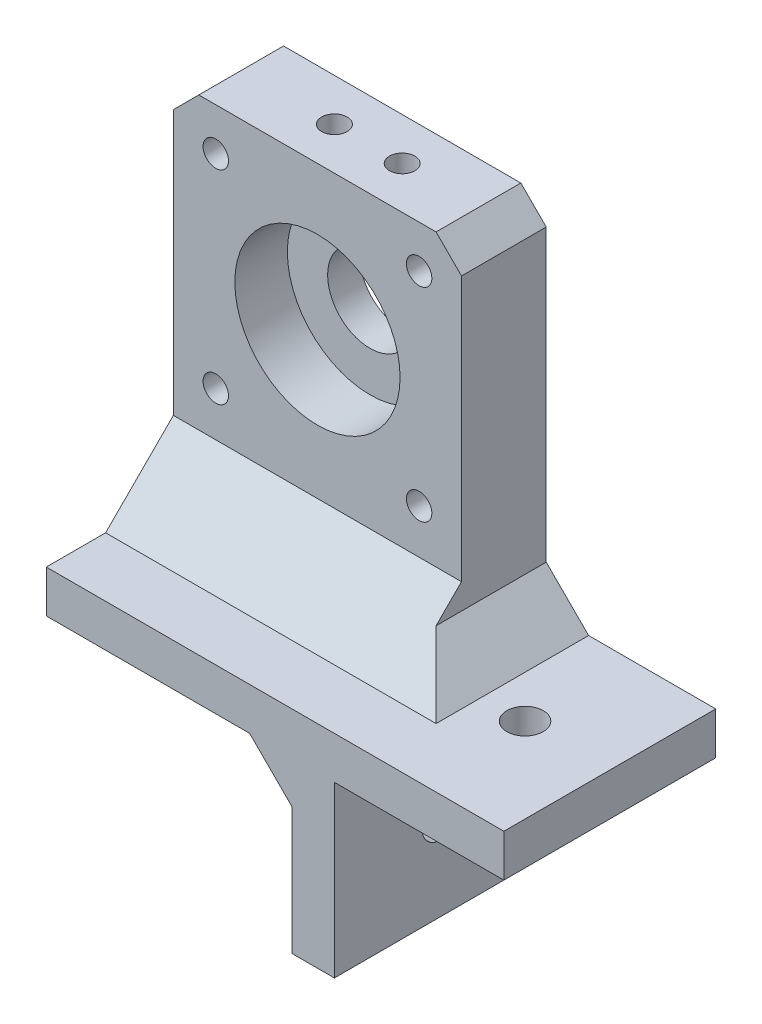
ISO-10303-21;
HEADER;
FILE_DESCRIPTION(('STEP AP214'),'2;1');
FILE_NAME('part.step','',(''),(''),'','','');
FILE_SCHEMA(('AUTOMOTIVE_DESIGN { 1 0 10303 214 1 1 1 1 }'));
ENDSEC;
DATA;
#1=APPLICATION_CONTEXT('core data for automotive mechanical design processes');
#2=APPLICATION_PROTOCOL_DEFINITION('international standard','automotive_design',2000,#1);
#3=PRODUCT_CONTEXT('',#1,'mechanical');
#4=PRODUCT('Part','Part','',(#3));
#5=PRODUCT_RELATED_PRODUCT_CATEGORY('part','',(#4));
#6=PRODUCT_DEFINITION_FORMATION('','',#4);
#7=PRODUCT_DEFINITION_CONTEXT('part definition',#1,'design');
#8=PRODUCT_DEFINITION('design','',#6,#7);
#9=PRODUCT_DEFINITION_SHAPE('','',#8);
#10=(LENGTH_UNIT() NAMED_UNIT(*) SI_UNIT(.MILLI.,.METRE.));
#11=(NAMED_UNIT(*) PLANE_ANGLE_UNIT() SI_UNIT($,.RADIAN.));
#12=(NAMED_UNIT(*) SI_UNIT($,.STERADIAN.) SOLID_ANGLE_UNIT());
#13=UNCERTAINTY_MEASURE_WITH_UNIT(LENGTH_MEASURE(1.E-05),#10,'distance_accuracy_value','');
#14=(GEOMETRIC_REPRESENTATION_CONTEXT(3) GLOBAL_UNCERTAINTY_ASSIGNED_CONTEXT((#13)) GLOBAL_UNIT_ASSIGNED_CONTEXT((#10,
#11,#12)) REPRESENTATION_CONTEXT('',''));
#15=CARTESIAN_POINT('',(0.,0.,0.));
#16=DIRECTION('',(0.,0.,1.));
#17=DIRECTION('',(1.,0.,0.));
#18=AXIS2_PLACEMENT_3D('',#15,#16,#17);
#19=CARTESIAN_POINT('',(-34.0000000000053,20.,25.));
#20=DIRECTION('',(0.,1.,0.));
#21=DIRECTION('',(-1.,0.,0.));
#22=AXIS2_PLACEMENT_3D('',#19,#20,#21);
#23=PLANE('',#22);
#24=DIRECTION('',(-1.,0.,0.));
#25=VECTOR('',#24,1.);
#26=CARTESIAN_POINT('',(-34.0000000000053,20.,30.));
#27=LINE('',#26,#25);
#28=CARTESIAN_POINT('',(-9.99999999999999,20.,30.));
#29=VERTEX_POINT('',#28);
#30=CARTESIAN_POINT('',(-34.0000000000053,20.,30.));
#31=VERTEX_POINT('',#30);
#32=EDGE_CURVE('E169',#29,#31,#27,.T.);
#33=ORIENTED_EDGE('',*,*,#32,.F.);
#34=DIRECTION('',(0.,0.,-1.));
#35=VECTOR('',#34,1.);
#36=CARTESIAN_POINT('',(-9.99999999999998,20.,25.));
#37=LINE('',#36,#35);
#38=CARTESIAN_POINT('',(-9.99999999999999,20.,50.));
#39=VERTEX_POINT('',#38);
#40=EDGE_CURVE('E361',#39,#29,#37,.T.);
#41=ORIENTED_EDGE('',*,*,#40,.F.);
#42=DIRECTION('',(1.,0.,0.));
#43=VECTOR('',#42,1.);
#44=CARTESIAN_POINT('',(-34.0000000000053,20.,50.));
#45=LINE('',#44,#43);
#46=CARTESIAN_POINT('',(-34.0000000000053,20.,50.));
#47=VERTEX_POINT('',#46);
#48=EDGE_CURVE('E329',#47,#39,#45,.T.);
#49=ORIENTED_EDGE('',*,*,#48,.F.);
#50=DIRECTION('',(0.,0.,1.));
#51=VECTOR('',#50,1.);
#52=CARTESIAN_POINT('',(-34.0000000000053,20.,25.));
#53=LINE('',#52,#51);
#54=EDGE_CURVE('E184',#31,#47,#53,.T.);
#55=ORIENTED_EDGE('',*,*,#54,.F.);
#56=EDGE_LOOP('',(#33,#41,#49,#55));
#57=FACE_BOUND('',#56,.T.);
#58=ADVANCED_FACE('F40',(#57),#23,.F.);
#59=CARTESIAN_POINT('',(-5.,20.,25.));
#60=DIRECTION('',(1.,0.,0.));
#61=DIRECTION('',(0.,1.,0.));
#62=AXIS2_PLACEMENT_3D('',#59,#60,#61);
#63=PLANE('',#62);
#64=CARTESIAN_POINT('',(-5.,10.,37.5));
#65=DIRECTION('',(-1.,0.,0.));
#66=DIRECTION('',(0.,1.,0.));
#67=AXIS2_PLACEMENT_3D('',#64,#65,#66);
#68=CIRCLE('',#67,2.15);
#69=CARTESIAN_POINT('',(-5.,12.15,37.5));
#70=VERTEX_POINT('',#69);
#71=EDGE_CURVE('E256',#70,#70,#68,.T.);
#72=ORIENTED_EDGE('',*,*,#71,.F.);
#73=EDGE_LOOP('',(#72));
#74=FACE_BOUND('',#73,.T.);
#75=DIRECTION('',(0.,1.,0.));
#76=VECTOR('',#75,1.);
#77=CARTESIAN_POINT('',(-5.,15.,30.));
#78=LINE('',#77,#76);
#79=CARTESIAN_POINT('',(-5.,0.,30.));
#80=VERTEX_POINT('',#79);
#81=CARTESIAN_POINT('',(-5.,15.,30.));
#82=VERTEX_POINT('',#81);
#83=EDGE_CURVE('E167',#80,#82,#78,.T.);
#84=ORIENTED_EDGE('',*,*,#83,.F.);
#85=DIRECTION('',(0.,0.,1.));
#86=VECTOR('',#85,1.);
#87=CARTESIAN_POINT('',(-5.,0.,25.));
#88=LINE('',#87,#86);
#89=CARTESIAN_POINT('',(-5.,0.,50.));
#90=VERTEX_POINT('',#89);
#91=EDGE_CURVE('E185',#80,#90,#88,.T.);
#92=ORIENTED_EDGE('',*,*,#91,.T.);
#93=DIRECTION('',(0.,-1.,0.));
#94=VECTOR('',#93,1.);
#95=CARTESIAN_POINT('',(-5.,20.,50.));
#96=LINE('',#95,#94);
#97=CARTESIAN_POINT('',(-5.,15.,50.));
#98=VERTEX_POINT('',#97);
#99=EDGE_CURVE('E281',#98,#90,#96,.T.);
#100=ORIENTED_EDGE('',*,*,#99,.F.);
#101=DIRECTION('',(0.,0.,1.));
#102=VECTOR('',#101,1.);
#103=CARTESIAN_POINT('',(-5.,15.,50.));
#104=LINE('',#103,#102);
#105=EDGE_CURVE('E199',#82,#98,#104,.T.);
#106=ORIENTED_EDGE('',*,*,#105,.F.);
#107=EDGE_LOOP('',(#84,#92,#100,#106));
#108=FACE_BOUND('',#107,.T.);
#109=ADVANCED_FACE('F197',(#74,#108),#63,.F.);
#110=CARTESIAN_POINT('',(-5.,15.,25.));
#111=DIRECTION('',(-0.707106781186551,-0.707106781186544,0.));
#112=DIRECTION('',(0.,0.,-1.));
#113=AXIS2_PLACEMENT_3D('',#110,#111,#112);
#114=PLANE('',#113);
#115=DIRECTION('',(-0.707106781186545,0.70710678118655,0.));
#116=VECTOR('',#115,1.);
#117=CARTESIAN_POINT('',(-9.99999999999999,20.,30.));
#118=LINE('',#117,#116);
#119=EDGE_CURVE('E201',#82,#29,#118,.T.);
#120=ORIENTED_EDGE('',*,*,#119,.F.);
#121=ORIENTED_EDGE('',*,*,#105,.T.);
#122=DIRECTION('',(0.707106781186544,-0.707106781186551,0.));
#123=VECTOR('',#122,1.);
#124=CARTESIAN_POINT('',(4.99999999999996,4.99999999999991,50.));
#125=LINE('',#124,#123);
#126=EDGE_CURVE('E370',#98,#39,#125,.F.);
#127=ORIENTED_EDGE('',*,*,#126,.T.);
#128=ORIENTED_EDGE('',*,*,#40,.T.);
#129=EDGE_LOOP('',(#120,#121,#127,#128));
#130=FACE_BOUND('',#129,.T.);
#131=ADVANCED_FACE('F472',(#130),#114,.T.);
#132=CARTESIAN_POINT('',(-17.0000000000053,50.25,25.));
#133=DIRECTION('',(0.,0.,1.));
#134=DIRECTION('',(-1.,0.,0.));
#135=AXIS2_PLACEMENT_3D('',#132,#133,#134);
#136=CYLINDRICAL_SURFACE('',#135,5.);
#137=CARTESIAN_POINT('',(-17.0000000000053,50.25,25.));
#138=DIRECTION('',(0.,0.,1.));
#139=DIRECTION('',(1.,0.,0.));
#140=AXIS2_PLACEMENT_3D('',#137,#138,#139);
#141=CIRCLE('',#140,5.);
#142=CARTESIAN_POINT('',(-12.0000000000053,50.25,25.));
#143=VERTEX_POINT('',#142);
#144=EDGE_CURVE('E273',#143,#143,#141,.T.);
#145=ORIENTED_EDGE('',*,*,#144,.F.);
#146=EDGE_LOOP('',(#145));
#147=FACE_BOUND('',#146,.T.);
#148=CARTESIAN_POINT('',(-17.0000000000053,50.25,28.8));
#149=DIRECTION('',(0.,0.,-1.));
#150=DIRECTION('',(-1.,0.,0.));
#151=AXIS2_PLACEMENT_3D('',#148,#149,#150);
#152=CIRCLE('',#151,5.);
#153=CARTESIAN_POINT('',(-22.0000000000053,50.25,28.8));
#154=VERTEX_POINT('',#153);
#155=EDGE_CURVE('E217',#154,#154,#152,.T.);
#156=ORIENTED_EDGE('',*,*,#155,.F.);
#157=EDGE_LOOP('',(#156));
#158=FACE_BOUND('',#157,.T.);
#159=ADVANCED_FACE('F474',(#147,#158),#136,.F.);
#160=CARTESIAN_POINT('',(-5.27702881392145E-12,25.,25.));
#161=DIRECTION('',(-1.,0.,0.));
#162=DIRECTION('',(0.,-1.,0.));
#163=AXIS2_PLACEMENT_3D('',#160,#161,#162);
#164=PLANE('',#163);
#165=DIRECTION('',(0.,-1.,0.));
#166=VECTOR('',#165,1.);
#167=CARTESIAN_POINT('',(-5.27588648512213E-12,67.25,35.));
#168=LINE('',#167,#166);
#169=CARTESIAN_POINT('',(-5.27626343105073E-12,64.25,35.));
#170=VERTEX_POINT('',#169);
#171=CARTESIAN_POINT('',(-5.2801899511403E-12,33.,35.));
#172=VERTEX_POINT('',#171);
#173=EDGE_CURVE('E221',#170,#172,#168,.T.);
#174=ORIENTED_EDGE('',*,*,#173,.T.);
#175=DIRECTION('',(0.,-0.707106781186544,0.707106781186551));
#176=VECTOR('',#175,1.);
#177=CARTESIAN_POINT('',(-5.27678547760917E-12,34.,34.));
#178=LINE('',#177,#176);
#179=CARTESIAN_POINT('',(-5.27689362708129E-12,30.,38.));
#180=VERTEX_POINT('',#179);
#181=EDGE_CURVE('E50',#172,#180,#178,.T.);
#182=ORIENTED_EDGE('',*,*,#181,.T.);
#183=DIRECTION('',(0.,0.,1.));
#184=VECTOR('',#183,1.);
#185=CARTESIAN_POINT('',(-5.27689362708129E-12,30.,35.));
#186=LINE('',#185,#184);
#187=CARTESIAN_POINT('',(-5.27689362708129E-12,30.,25.));
#188=VERTEX_POINT('',#187);
#189=EDGE_CURVE('E56',#188,#180,#186,.T.);
#190=ORIENTED_EDGE('',*,*,#189,.F.);
#191=DIRECTION('',(0.,1.,0.));
#192=VECTOR('',#191,1.);
#193=CARTESIAN_POINT('',(-5.27702881392145E-12,25.,25.));
#194=LINE('',#193,#192);
#195=CARTESIAN_POINT('',(-5.27596759722623E-12,64.25,25.));
#196=VERTEX_POINT('',#195);
#197=EDGE_CURVE('E297',#188,#196,#194,.T.);
#198=ORIENTED_EDGE('',*,*,#197,.T.);
#199=DIRECTION('',(0.,0.,-1.));
#200=VECTOR('',#199,1.);
#201=CARTESIAN_POINT('',(-5.27596759722623E-12,64.25,25.));
#202=LINE('',#201,#200);
#203=EDGE_CURVE('E401',#170,#196,#202,.T.);
#204=ORIENTED_EDGE('',*,*,#203,.F.);
#205=EDGE_LOOP('',(#174,#182,#190,#198,#204));
#206=FACE_BOUND('',#205,.T.);
#207=ADVANCED_FACE('F420',(#206),#164,.F.);
#208=CARTESIAN_POINT('',(-5.27588648512213E-12,67.25,25.));
#209=DIRECTION('',(0.,-1.,0.));
#210=DIRECTION('',(0.,0.,1.));
#211=AXIS2_PLACEMENT_3D('',#208,#209,#210);
#212=PLANE('',#211);
#213=CARTESIAN_POINT('',(-12.0000000000053,67.25,30.));
#214=DIRECTION('',(0.,1.,0.));
#215=DIRECTION('',(0.,0.,1.));
#216=AXIS2_PLACEMENT_3D('',#213,#214,#215);
#217=CIRCLE('',#216,1.5);
#218=CARTESIAN_POINT('',(-12.0000000000053,67.25,31.5));
#219=VERTEX_POINT('',#218);
#220=EDGE_CURVE('E596',#219,#219,#217,.T.);
#221=ORIENTED_EDGE('',*,*,#220,.F.);
#222=EDGE_LOOP('',(#221));
#223=FACE_BOUND('',#222,.T.);
#224=CARTESIAN_POINT('',(-20.0000000000053,67.25,30.));
#225=DIRECTION('',(0.,1.,0.));
#226=DIRECTION('',(0.,0.,1.));
#227=AXIS2_PLACEMENT_3D('',#224,#225,#226);
#228=CIRCLE('',#227,1.5);
#229=CARTESIAN_POINT('',(-20.0000000000053,67.25,31.5));
#230=VERTEX_POINT('',#229);
#231=EDGE_CURVE('E609',#230,#230,#228,.T.);
#232=ORIENTED_EDGE('',*,*,#231,.F.);
#233=EDGE_LOOP('',(#232));
#234=FACE_BOUND('',#233,.T.);
#235=DIRECTION('',(1.,0.,0.));
#236=VECTOR('',#235,1.);
#237=CARTESIAN_POINT('',(-5.27588648512213E-12,67.25,35.));
#238=LINE('',#237,#236);
#239=CARTESIAN_POINT('',(-31.0000000000053,67.25,35.));
#240=VERTEX_POINT('',#239);
#241=CARTESIAN_POINT('',(-3.00000000000528,67.25,35.));
#242=VERTEX_POINT('',#241);
#243=EDGE_CURVE('E227',#240,#242,#238,.T.);
#244=ORIENTED_EDGE('',*,*,#243,.T.);
#245=DIRECTION('',(0.,0.,1.));
#246=VECTOR('',#245,1.);
#247=CARTESIAN_POINT('',(-3.00000000000528,67.25,25.));
#248=LINE('',#247,#246);
#249=CARTESIAN_POINT('',(-3.00000000000528,67.25,25.));
#250=VERTEX_POINT('',#249);
#251=EDGE_CURVE('E386',#250,#242,#248,.T.);
#252=ORIENTED_EDGE('',*,*,#251,.F.);
#253=DIRECTION('',(-1.,0.,0.));
#254=VECTOR('',#253,1.);
#255=CARTESIAN_POINT('',(-5.27588648512213E-12,67.25,25.));
#256=LINE('',#255,#254);
#257=CARTESIAN_POINT('',(-31.0000000000053,67.25,25.));
#258=VERTEX_POINT('',#257);
#259=EDGE_CURVE('E301',#250,#258,#256,.T.);
#260=ORIENTED_EDGE('',*,*,#259,.T.);
#261=DIRECTION('',(0.,0.,-1.));
#262=VECTOR('',#261,1.);
#263=CARTESIAN_POINT('',(-31.0000000000053,67.25,25.));
#264=LINE('',#263,#262);
#265=EDGE_CURVE('E390',#240,#258,#264,.T.);
#266=ORIENTED_EDGE('',*,*,#265,.F.);
#267=EDGE_LOOP('',(#244,#252,#260,#266));
#268=FACE_BOUND('',#267,.T.);
#269=ADVANCED_FACE('F444',(#223,#234,#268),#212,.F.);
#270=CARTESIAN_POINT('',(-29.0000000000053,62.25,25.));
#271=DIRECTION('',(0.,0.,1.));
#272=DIRECTION('',(-1.,0.,0.));
#273=AXIS2_PLACEMENT_3D('',#270,#271,#272);
#274=CYLINDRICAL_SURFACE('',#273,1.5);
#275=CARTESIAN_POINT('',(-29.0000000000053,62.25,25.));
#276=DIRECTION('',(0.,0.,1.));
#277=DIRECTION('',(1.,0.,0.));
#278=AXIS2_PLACEMENT_3D('',#275,#276,#277);
#279=CIRCLE('',#278,1.5);
#280=CARTESIAN_POINT('',(-27.5000000000053,62.25,25.));
#281=VERTEX_POINT('',#280);
#282=EDGE_CURVE('E269',#281,#281,#279,.T.);
#283=ORIENTED_EDGE('',*,*,#282,.F.);
#284=EDGE_LOOP('',(#283));
#285=FACE_BOUND('',#284,.T.);
#286=CARTESIAN_POINT('',(-29.0000000000053,62.25,35.));
#287=DIRECTION('',(0.,0.,-1.));
#288=DIRECTION('',(-1.,0.,0.));
#289=AXIS2_PLACEMENT_3D('',#286,#287,#288);
#290=CIRCLE('',#289,1.5);
#291=CARTESIAN_POINT('',(-30.5000000000053,62.25,35.));
#292=VERTEX_POINT('',#291);
#293=EDGE_CURVE('E243',#292,#292,#290,.T.);
#294=ORIENTED_EDGE('',*,*,#293,.F.);
#295=EDGE_LOOP('',(#294));
#296=FACE_BOUND('',#295,.T.);
#297=ADVANCED_FACE('F498',(#285,#296),#274,.F.);
#298=CARTESIAN_POINT('',(-5.00000000000528,62.25,25.));
#299=DIRECTION('',(0.,0.,1.));
#300=DIRECTION('',(-1.,0.,0.));
#301=AXIS2_PLACEMENT_3D('',#298,#299,#300);
#302=CYLINDRICAL_SURFACE('',#301,1.5);
#303=CARTESIAN_POINT('',(-5.00000000000528,62.25,25.));
#304=DIRECTION('',(0.,0.,1.));
#305=DIRECTION('',(1.,0.,0.));
#306=AXIS2_PLACEMENT_3D('',#303,#304,#305);
#307=CIRCLE('',#306,1.5);
#308=CARTESIAN_POINT('',(-3.50000000000528,62.25,25.));
#309=VERTEX_POINT('',#308);
#310=EDGE_CURVE('E265',#309,#309,#307,.T.);
#311=ORIENTED_EDGE('',*,*,#310,.F.);
#312=EDGE_LOOP('',(#311));
#313=FACE_BOUND('',#312,.T.);
#314=CARTESIAN_POINT('',(-5.00000000000528,62.25,35.));
#315=DIRECTION('',(0.,0.,-1.));
#316=DIRECTION('',(-1.,0.,0.));
#317=AXIS2_PLACEMENT_3D('',#314,#315,#316);
#318=CIRCLE('',#317,1.5);
#319=CARTESIAN_POINT('',(-6.50000000000528,62.25,35.));
#320=VERTEX_POINT('',#319);
#321=EDGE_CURVE('E239',#320,#320,#318,.T.);
#322=ORIENTED_EDGE('',*,*,#321,.F.);
#323=EDGE_LOOP('',(#322));
#324=FACE_BOUND('',#323,.T.);
#325=ADVANCED_FACE('F524',(#313,#324),#302,.F.);
#326=CARTESIAN_POINT('',(-29.0000000000053,38.25,25.));
#327=DIRECTION('',(0.,0.,1.));
#328=DIRECTION('',(-1.,0.,0.));
#329=AXIS2_PLACEMENT_3D('',#326,#327,#328);
#330=CYLINDRICAL_SURFACE('',#329,1.5);
#331=CARTESIAN_POINT('',(-29.0000000000053,38.25,25.));
#332=DIRECTION('',(0.,0.,1.));
#333=DIRECTION('',(1.,0.,0.));
#334=AXIS2_PLACEMENT_3D('',#331,#332,#333);
#335=CIRCLE('',#334,1.5);
#336=CARTESIAN_POINT('',(-27.5000000000053,38.25,25.));
#337=VERTEX_POINT('',#336);
#338=EDGE_CURVE('E261',#337,#337,#335,.T.);
#339=ORIENTED_EDGE('',*,*,#338,.F.);
#340=EDGE_LOOP('',(#339));
#341=FACE_BOUND('',#340,.T.);
#342=CARTESIAN_POINT('',(-29.0000000000053,38.25,35.));
#343=DIRECTION('',(0.,0.,-1.));
#344=DIRECTION('',(-1.,0.,0.));
#345=AXIS2_PLACEMENT_3D('',#342,#343,#344);
#346=CIRCLE('',#345,1.5);
#347=CARTESIAN_POINT('',(-30.5000000000053,38.25,35.));
#348=VERTEX_POINT('',#347);
#349=EDGE_CURVE('E235',#348,#348,#346,.T.);
#350=ORIENTED_EDGE('',*,*,#349,.F.);
#351=EDGE_LOOP('',(#350));
#352=FACE_BOUND('',#351,.T.);
#353=ADVANCED_FACE('F528',(#341,#352),#330,.F.);
#354=CARTESIAN_POINT('',(-5.00000000000528,38.25,25.));
#355=DIRECTION('',(0.,0.,1.));
#356=DIRECTION('',(-1.,0.,0.));
#357=AXIS2_PLACEMENT_3D('',#354,#355,#356);
#358=CYLINDRICAL_SURFACE('',#357,1.5);
#359=CARTESIAN_POINT('',(-5.00000000000528,38.25,25.));
#360=DIRECTION('',(0.,0.,1.));
#361=DIRECTION('',(1.,0.,0.));
#362=AXIS2_PLACEMENT_3D('',#359,#360,#361);
#363=CIRCLE('',#362,1.5);
#364=CARTESIAN_POINT('',(-3.50000000000528,38.25,25.));
#365=VERTEX_POINT('',#364);
#366=EDGE_CURVE('E257',#365,#365,#363,.T.);
#367=ORIENTED_EDGE('',*,*,#366,.F.);
#368=EDGE_LOOP('',(#367));
#369=FACE_BOUND('',#368,.T.);
#370=CARTESIAN_POINT('',(-5.00000000000528,38.25,35.));
#371=DIRECTION('',(0.,0.,-1.));
#372=DIRECTION('',(-1.,0.,0.));
#373=AXIS2_PLACEMENT_3D('',#370,#371,#372);
#374=CIRCLE('',#373,1.5);
#375=CARTESIAN_POINT('',(-6.50000000000528,38.25,35.));
#376=VERTEX_POINT('',#375);
#377=EDGE_CURVE('E234',#376,#376,#374,.T.);
#378=ORIENTED_EDGE('',*,*,#377,.F.);
#379=EDGE_LOOP('',(#378));
#380=FACE_BOUND('',#379,.T.);
#381=ADVANCED_FACE('F519',(#369,#380),#358,.F.);
#382=CARTESIAN_POINT('',(0.,0.,25.));
#383=DIRECTION('',(0.,0.,-1.));
#384=DIRECTION('',(1.,0.,0.));
#385=AXIS2_PLACEMENT_3D('',#382,#383,#384);
#386=PLANE('',#385);
#387=DIRECTION('',(0.823212785915355,-0.56773295580359,0.));
#388=VECTOR('',#387,1.);
#389=CARTESIAN_POINT('',(-5.,0.,25.));
#390=LINE('',#389,#388);
#391=CARTESIAN_POINT('',(-34.0000000000053,20.,25.));
#392=VERTEX_POINT('',#391);
#393=CARTESIAN_POINT('',(-5.,0.,25.));
#394=VERTEX_POINT('',#393);
#395=EDGE_CURVE('E173',#392,#394,#390,.T.);
#396=ORIENTED_EDGE('',*,*,#395,.F.);
#397=DIRECTION('',(0.,-1.,0.));
#398=VECTOR('',#397,1.);
#399=CARTESIAN_POINT('',(-34.0000000000053,67.25,25.));
#400=LINE('',#399,#398);
#401=CARTESIAN_POINT('',(-34.0000000000053,64.25,25.));
#402=VERTEX_POINT('',#401);
#403=EDGE_CURVE('E195',#402,#392,#400,.T.);
#404=ORIENTED_EDGE('',*,*,#403,.F.);
#405=DIRECTION('',(0.707106781186549,0.707106781186546,0.));
#406=VECTOR('',#405,1.);
#407=CARTESIAN_POINT('',(-49.1250000000026,49.1250000000028,25.));
#408=LINE('',#407,#406);
#409=EDGE_CURVE('E397',#258,#402,#408,.F.);
#410=ORIENTED_EDGE('',*,*,#409,.F.);
#411=ORIENTED_EDGE('',*,*,#259,.F.);
#412=DIRECTION('',(0.707106781186544,-0.707106781186551,0.));
#413=VECTOR('',#412,1.);
#414=CARTESIAN_POINT('',(32.1249999999974,32.124999999997,25.));
#415=LINE('',#414,#413);
#416=EDGE_CURVE('E394',#196,#250,#415,.F.);
#417=ORIENTED_EDGE('',*,*,#416,.F.);
#418=ORIENTED_EDGE('',*,*,#197,.F.);
#419=DIRECTION('',(0.707106781186543,-0.707106781186552,0.));
#420=VECTOR('',#419,1.);
#421=CARTESIAN_POINT('',(-5.27689362708129E-12,30.,25.));
#422=LINE('',#421,#420);
#423=CARTESIAN_POINT('',(4.99999999999467,25.,25.));
#424=VERTEX_POINT('',#423);
#425=EDGE_CURVE('E373',#424,#188,#422,.F.);
#426=ORIENTED_EDGE('',*,*,#425,.F.);
#427=DIRECTION('',(-1.,0.,0.));
#428=VECTOR('',#427,1.);
#429=CARTESIAN_POINT('',(20.,25.,25.));
#430=LINE('',#429,#428);
#431=CARTESIAN_POINT('',(20.,25.,25.));
#432=VERTEX_POINT('',#431);
#433=EDGE_CURVE('E293',#432,#424,#430,.T.);
#434=ORIENTED_EDGE('',*,*,#433,.F.);
#435=DIRECTION('',(0.,1.,0.));
#436=VECTOR('',#435,1.);
#437=CARTESIAN_POINT('',(20.,20.,25.));
#438=LINE('',#437,#436);
#439=CARTESIAN_POINT('',(20.,20.,25.));
#440=VERTEX_POINT('',#439);
#441=EDGE_CURVE('E289',#440,#432,#438,.T.);
#442=ORIENTED_EDGE('',*,*,#441,.F.);
#443=DIRECTION('',(1.,0.,0.));
#444=VECTOR('',#443,1.);
#445=CARTESIAN_POINT('',(0.,20.,25.));
#446=LINE('',#445,#444);
#447=CARTESIAN_POINT('',(0.,20.,25.));
#448=VERTEX_POINT('',#447);
#449=EDGE_CURVE('E285',#448,#440,#446,.T.);
#450=ORIENTED_EDGE('',*,*,#449,.F.);
#451=DIRECTION('',(0.,1.,0.));
#452=VECTOR('',#451,1.);
#453=CARTESIAN_POINT('',(0.,0.,25.));
#454=LINE('',#453,#452);
#455=CARTESIAN_POINT('',(0.,0.,25.));
#456=VERTEX_POINT('',#455);
#457=EDGE_CURVE('E280',#456,#448,#454,.T.);
#458=ORIENTED_EDGE('',*,*,#457,.F.);
#459=DIRECTION('',(1.,0.,0.));
#460=VECTOR('',#459,1.);
#461=CARTESIAN_POINT('',(-5.,0.,25.));
#462=LINE('',#461,#460);
#463=EDGE_CURVE('E277',#394,#456,#462,.T.);
#464=ORIENTED_EDGE('',*,*,#463,.F.);
#465=EDGE_LOOP('',(#396,#404,#410,#411,#417,#418,#426,#434,#442,#450,#458,#464));
#466=FACE_BOUND('',#465,.T.);
#467=ORIENTED_EDGE('',*,*,#338,.T.);
#468=EDGE_LOOP('',(#467));
#469=FACE_BOUND('',#468,.T.);
#470=ORIENTED_EDGE('',*,*,#282,.T.);
#471=EDGE_LOOP('',(#470));
#472=FACE_BOUND('',#471,.T.);
#473=ORIENTED_EDGE('',*,*,#144,.T.);
#474=EDGE_LOOP('',(#473));
#475=FACE_BOUND('',#474,.T.);
#476=ORIENTED_EDGE('',*,*,#310,.T.);
#477=EDGE_LOOP('',(#476));
#478=FACE_BOUND('',#477,.T.);
#479=ORIENTED_EDGE('',*,*,#366,.T.);
#480=EDGE_LOOP('',(#479));
#481=FACE_BOUND('',#480,.T.);
#482=ADVANCED_FACE('F433',(#466,#469,#472,#475,#478,#481),#386,.T.);
#483=CARTESIAN_POINT('',(0.,0.,50.));
#484=DIRECTION('',(0.,0.,-1.));
#485=DIRECTION('',(1.,0.,0.));
#486=AXIS2_PLACEMENT_3D('',#483,#484,#485);
#487=PLANE('',#486);
#488=DIRECTION('',(0.,-1.,0.));
#489=VECTOR('',#488,1.);
#490=CARTESIAN_POINT('',(-34.0000000000053,67.25,50.));
#491=LINE('',#490,#489);
#492=CARTESIAN_POINT('',(-34.0000000000053,25.,50.));
#493=VERTEX_POINT('',#492);
#494=EDGE_CURVE('E326',#493,#47,#491,.T.);
#495=ORIENTED_EDGE('',*,*,#494,.T.);
#496=ORIENTED_EDGE('',*,*,#48,.T.);
#497=ORIENTED_EDGE('',*,*,#126,.F.);
#498=ORIENTED_EDGE('',*,*,#99,.T.);
#499=DIRECTION('',(1.,0.,0.));
#500=VECTOR('',#499,1.);
#501=CARTESIAN_POINT('',(-5.,0.,50.));
#502=LINE('',#501,#500);
#503=CARTESIAN_POINT('',(0.,0.,50.));
#504=VERTEX_POINT('',#503);
#505=EDGE_CURVE('E190',#90,#504,#502,.T.);
#506=ORIENTED_EDGE('',*,*,#505,.T.);
#507=DIRECTION('',(0.,1.,0.));
#508=VECTOR('',#507,1.);
#509=CARTESIAN_POINT('',(0.,0.,50.));
#510=LINE('',#509,#508);
#511=CARTESIAN_POINT('',(0.,20.,50.));
#512=VERTEX_POINT('',#511);
#513=EDGE_CURVE('E310',#504,#512,#510,.T.);
#514=ORIENTED_EDGE('',*,*,#513,.T.);
#515=DIRECTION('',(1.,0.,0.));
#516=VECTOR('',#515,1.);
#517=CARTESIAN_POINT('',(0.,20.,50.));
#518=LINE('',#517,#516);
#519=CARTESIAN_POINT('',(20.,20.,50.));
#520=VERTEX_POINT('',#519);
#521=EDGE_CURVE('E314',#512,#520,#518,.T.);
#522=ORIENTED_EDGE('',*,*,#521,.T.);
#523=DIRECTION('',(0.,1.,0.));
#524=VECTOR('',#523,1.);
#525=CARTESIAN_POINT('',(20.,20.,50.));
#526=LINE('',#525,#524);
#527=CARTESIAN_POINT('',(20.,25.,50.));
#528=VERTEX_POINT('',#527);
#529=EDGE_CURVE('E318',#520,#528,#526,.T.);
#530=ORIENTED_EDGE('',*,*,#529,.T.);
#531=DIRECTION('',(-1.,0.,0.));
#532=VECTOR('',#531,1.);
#533=CARTESIAN_POINT('',(20.,25.,50.));
#534=LINE('',#533,#532);
#535=EDGE_CURVE('E322',#528,#493,#534,.T.);
#536=ORIENTED_EDGE('',*,*,#535,.T.);
#537=EDGE_LOOP('',(#495,#496,#497,#498,#506,#514,#522,#530,#536));
#538=FACE_BOUND('',#537,.T.);
#539=ADVANCED_FACE('F456',(#538),#487,.F.);
#540=CARTESIAN_POINT('',(-5.,0.,25.));
#541=DIRECTION('',(0.,1.,0.));
#542=DIRECTION('',(0.,0.,-1.));
#543=AXIS2_PLACEMENT_3D('',#540,#541,#542);
#544=PLANE('',#543);
#545=ORIENTED_EDGE('',*,*,#505,.F.);
#546=ORIENTED_EDGE('',*,*,#91,.F.);
#547=EDGE_CURVE('E176',#394,#80,#88,.T.);
#548=ORIENTED_EDGE('',*,*,#547,.F.);
#549=ORIENTED_EDGE('',*,*,#463,.T.);
#550=DIRECTION('',(0.,0.,1.));
#551=VECTOR('',#550,1.);
#552=CARTESIAN_POINT('',(0.,0.,25.));
#553=LINE('',#552,#551);
#554=EDGE_CURVE('E347',#456,#504,#553,.T.);
#555=ORIENTED_EDGE('',*,*,#554,.T.);
#556=EDGE_LOOP('',(#545,#546,#548,#549,#555));
#557=FACE_BOUND('',#556,.T.);
#558=ADVANCED_FACE('F188',(#557),#544,.F.);
#559=CARTESIAN_POINT('',(0.,0.,25.));
#560=DIRECTION('',(-1.,0.,0.));
#561=DIRECTION('',(0.,0.,-1.));
#562=AXIS2_PLACEMENT_3D('',#559,#560,#561);
#563=PLANE('',#562);
#564=CARTESIAN_POINT('',(0.,10.,37.5));
#565=DIRECTION('',(-1.,0.,0.));
#566=DIRECTION('',(0.,0.,1.));
#567=AXIS2_PLACEMENT_3D('',#564,#565,#566);
#568=CIRCLE('',#567,2.15);
#569=CARTESIAN_POINT('',(0.,10.,39.65));
#570=VERTEX_POINT('',#569);
#571=EDGE_CURVE('E252',#570,#570,#568,.T.);
#572=ORIENTED_EDGE('',*,*,#571,.T.);
#573=EDGE_LOOP('',(#572));
#574=FACE_BOUND('',#573,.T.);
#575=ORIENTED_EDGE('',*,*,#513,.F.);
#576=ORIENTED_EDGE('',*,*,#554,.F.);
#577=ORIENTED_EDGE('',*,*,#457,.T.);
#578=DIRECTION('',(0.,0.,1.));
#579=VECTOR('',#578,1.);
#580=CARTESIAN_POINT('',(0.,20.,25.));
#581=LINE('',#580,#579);
#582=EDGE_CURVE('E344',#448,#512,#581,.T.);
#583=ORIENTED_EDGE('',*,*,#582,.T.);
#584=EDGE_LOOP('',(#575,#576,#577,#583));
#585=FACE_BOUND('',#584,.T.);
#586=ADVANCED_FACE('F468',(#574,#585),#563,.F.);
#587=CARTESIAN_POINT('',(0.,20.,25.));
#588=DIRECTION('',(0.,1.,0.));
#589=DIRECTION('',(0.,0.,-1.));
#590=AXIS2_PLACEMENT_3D('',#587,#588,#589);
#591=PLANE('',#590);
#592=CARTESIAN_POINT('',(10.,20.,37.5));
#593=DIRECTION('',(0.,1.,0.));
#594=DIRECTION('',(0.,0.,1.));
#595=AXIS2_PLACEMENT_3D('',#592,#593,#594);
#596=CIRCLE('',#595,2.15);
#597=CARTESIAN_POINT('',(10.,20.,39.65));
#598=VERTEX_POINT('',#597);
#599=EDGE_CURVE('E247',#598,#598,#596,.T.);
#600=ORIENTED_EDGE('',*,*,#599,.T.);
#601=EDGE_LOOP('',(#600));
#602=FACE_BOUND('',#601,.T.);
#603=ORIENTED_EDGE('',*,*,#521,.F.);
#604=ORIENTED_EDGE('',*,*,#582,.F.);
#605=ORIENTED_EDGE('',*,*,#449,.T.);
#606=DIRECTION('',(0.,0.,1.));
#607=VECTOR('',#606,1.);
#608=CARTESIAN_POINT('',(20.,20.,25.));
#609=LINE('',#608,#607);
#610=EDGE_CURVE('E341',#440,#520,#609,.T.);
#611=ORIENTED_EDGE('',*,*,#610,.T.);
#612=EDGE_LOOP('',(#603,#604,#605,#611));
#613=FACE_BOUND('',#612,.T.);
#614=ADVANCED_FACE('F465',(#602,#613),#591,.F.);
#615=CARTESIAN_POINT('',(20.,20.,25.));
#616=DIRECTION('',(-1.,0.,0.));
#617=DIRECTION('',(0.,0.,-1.));
#618=AXIS2_PLACEMENT_3D('',#615,#616,#617);
#619=PLANE('',#618);
#620=ORIENTED_EDGE('',*,*,#529,.F.);
#621=ORIENTED_EDGE('',*,*,#610,.F.);
#622=ORIENTED_EDGE('',*,*,#441,.T.);
#623=DIRECTION('',(0.,0.,1.));
#624=VECTOR('',#623,1.);
#625=CARTESIAN_POINT('',(20.,25.,25.));
#626=LINE('',#625,#624);
#627=EDGE_CURVE('E338',#432,#528,#626,.T.);
#628=ORIENTED_EDGE('',*,*,#627,.T.);
#629=EDGE_LOOP('',(#620,#621,#622,#628));
#630=FACE_BOUND('',#629,.T.);
#631=ADVANCED_FACE('F461',(#630),#619,.F.);
#632=CARTESIAN_POINT('',(20.,25.,25.));
#633=DIRECTION('',(0.,-1.,0.));
#634=DIRECTION('',(1.,0.,0.));
#635=AXIS2_PLACEMENT_3D('',#632,#633,#634);
#636=PLANE('',#635);
#637=CARTESIAN_POINT('',(10.,25.,37.5));
#638=DIRECTION('',(0.,1.,0.));
#639=DIRECTION('',(1.,0.,0.));
#640=AXIS2_PLACEMENT_3D('',#637,#638,#639);
#641=CIRCLE('',#640,2.15);
#642=CARTESIAN_POINT('',(12.15,25.,37.5));
#643=VERTEX_POINT('',#642);
#644=EDGE_CURVE('E251',#643,#643,#641,.T.);
#645=ORIENTED_EDGE('',*,*,#644,.F.);
#646=EDGE_LOOP('',(#645));
#647=FACE_BOUND('',#646,.T.);
#648=DIRECTION('',(0.,0.,-1.));
#649=VECTOR('',#648,1.);
#650=CARTESIAN_POINT('',(4.99999999999467,25.,25.));
#651=LINE('',#650,#649);
#652=CARTESIAN_POINT('',(4.99999999999467,25.,43.0000000000001));
#653=VERTEX_POINT('',#652);
#654=EDGE_CURVE('E367',#653,#424,#651,.T.);
#655=ORIENTED_EDGE('',*,*,#654,.F.);
#656=DIRECTION('',(-1.,0.,0.));
#657=VECTOR('',#656,1.);
#658=CARTESIAN_POINT('',(20.,25.,43.0000000000001));
#659=LINE('',#658,#657);
#660=CARTESIAN_POINT('',(-34.0000000000053,25.,43.0000000000001));
#661=VERTEX_POINT('',#660);
#662=EDGE_CURVE('E405',#653,#661,#659,.T.);
#663=ORIENTED_EDGE('',*,*,#662,.T.);
#664=DIRECTION('',(0.,0.,1.));
#665=VECTOR('',#664,1.);
#666=CARTESIAN_POINT('',(-34.0000000000053,25.,35.));
#667=LINE('',#666,#665);
#668=EDGE_CURVE('E231',#661,#493,#667,.T.);
#669=ORIENTED_EDGE('',*,*,#668,.T.);
#670=ORIENTED_EDGE('',*,*,#535,.F.);
#671=ORIENTED_EDGE('',*,*,#627,.F.);
#672=ORIENTED_EDGE('',*,*,#433,.T.);
#673=EDGE_LOOP('',(#655,#663,#669,#670,#671,#672));
#674=FACE_BOUND('',#673,.T.);
#675=ADVANCED_FACE('F429',(#647,#674),#636,.F.);
#676=CARTESIAN_POINT('',(-34.0000000000053,67.25,25.));
#677=DIRECTION('',(1.,0.,0.));
#678=DIRECTION('',(0.,1.,0.));
#679=AXIS2_PLACEMENT_3D('',#676,#677,#678);
#680=PLANE('',#679);
#681=CARTESIAN_POINT('',(-34.0000000000053,24.,40.));
#682=DIRECTION('',(-1.,0.,0.));
#683=DIRECTION('',(0.,-1.,0.));
#684=AXIS2_PLACEMENT_3D('',#681,#682,#683);
#685=CIRCLE('',#684,1.5);
#686=CARTESIAN_POINT('',(-34.0000000000053,22.5,40.));
#687=VERTEX_POINT('',#686);
#688=EDGE_CURVE('E616',#687,#687,#685,.T.);
#689=ORIENTED_EDGE('',*,*,#688,.F.);
#690=EDGE_LOOP('',(#689));
#691=FACE_BOUND('',#690,.T.);
#692=CARTESIAN_POINT('',(-34.0000000000053,24.,32.));
#693=DIRECTION('',(-1.,0.,0.));
#694=DIRECTION('',(0.,-1.,0.));
#695=AXIS2_PLACEMENT_3D('',#692,#693,#694);
#696=CIRCLE('',#695,1.5);
#697=CARTESIAN_POINT('',(-34.0000000000053,22.5,32.));
#698=VERTEX_POINT('',#697);
#699=EDGE_CURVE('E595',#698,#698,#696,.T.);
#700=ORIENTED_EDGE('',*,*,#699,.F.);
#701=EDGE_LOOP('',(#700));
#702=FACE_BOUND('',#701,.T.);
#703=ORIENTED_EDGE('',*,*,#403,.T.);
#704=EDGE_CURVE('E335',#392,#31,#53,.T.);
#705=ORIENTED_EDGE('',*,*,#704,.T.);
#706=ORIENTED_EDGE('',*,*,#54,.T.);
#707=ORIENTED_EDGE('',*,*,#494,.F.);
#708=ORIENTED_EDGE('',*,*,#668,.F.);
#709=DIRECTION('',(0.,0.707106781186544,-0.707106781186551));
#710=VECTOR('',#709,1.);
#711=CARTESIAN_POINT('',(-34.0000000000053,55.1249999999998,12.8749999999999));
#712=LINE('',#711,#710);
#713=CARTESIAN_POINT('',(-34.0000000000053,33.,35.));
#714=VERTEX_POINT('',#713);
#715=EDGE_CURVE('E414',#661,#714,#712,.T.);
#716=ORIENTED_EDGE('',*,*,#715,.T.);
#717=DIRECTION('',(0.,1.,0.));
#718=VECTOR('',#717,1.);
#719=CARTESIAN_POINT('',(-34.0000000000053,67.25,35.));
#720=LINE('',#719,#718);
#721=CARTESIAN_POINT('',(-34.0000000000053,64.25,35.));
#722=VERTEX_POINT('',#721);
#723=EDGE_CURVE('E224',#714,#722,#720,.T.);
#724=ORIENTED_EDGE('',*,*,#723,.T.);
#725=DIRECTION('',(0.,0.,1.));
#726=VECTOR('',#725,1.);
#727=CARTESIAN_POINT('',(-34.0000000000053,64.25,25.));
#728=LINE('',#727,#726);
#729=EDGE_CURVE('E376',#402,#722,#728,.T.);
#730=ORIENTED_EDGE('',*,*,#729,.F.);
#731=EDGE_LOOP('',(#703,#705,#706,#707,#708,#716,#724,#730));
#732=FACE_BOUND('',#731,.T.);
#733=ADVANCED_FACE('F451',(#691,#702,#732),#680,.F.);
#734=CARTESIAN_POINT('',(-30.,10.,37.5));
#735=DIRECTION('',(1.,0.,0.));
#736=DIRECTION('',(0.,0.,1.));
#737=AXIS2_PLACEMENT_3D('',#734,#735,#736);
#738=CYLINDRICAL_SURFACE('',#737,2.15);
#739=ORIENTED_EDGE('',*,*,#571,.F.);
#740=EDGE_LOOP('',(#739));
#741=FACE_BOUND('',#740,.T.);
#742=ORIENTED_EDGE('',*,*,#71,.T.);
#743=EDGE_LOOP('',(#742));
#744=FACE_BOUND('',#743,.T.);
#745=ADVANCED_FACE('F494',(#741,#744),#738,.F.);
#746=CARTESIAN_POINT('',(10.,50.,37.5));
#747=DIRECTION('',(0.,-1.,0.));
#748=DIRECTION('',(0.,0.,1.));
#749=AXIS2_PLACEMENT_3D('',#746,#747,#748);
#750=CYLINDRICAL_SURFACE('',#749,2.15);
#751=ORIENTED_EDGE('',*,*,#599,.F.);
#752=EDGE_LOOP('',(#751));
#753=FACE_BOUND('',#752,.T.);
#754=ORIENTED_EDGE('',*,*,#644,.T.);
#755=EDGE_LOOP('',(#754));
#756=FACE_BOUND('',#755,.T.);
#757=ADVANCED_FACE('F538',(#753,#756),#750,.F.);
#758=CARTESIAN_POINT('',(0.,0.,35.));
#759=DIRECTION('',(0.,0.,1.));
#760=DIRECTION('',(-1.,0.,0.));
#761=AXIS2_PLACEMENT_3D('',#758,#759,#760);
#762=PLANE('',#761);
#763=CARTESIAN_POINT('',(-17.0000000000053,50.25,35.));
#764=DIRECTION('',(0.,0.,-1.));
#765=DIRECTION('',(-1.,0.,0.));
#766=AXIS2_PLACEMENT_3D('',#763,#764,#765);
#767=CIRCLE('',#766,9.75);
#768=CARTESIAN_POINT('',(-26.7500000000053,50.25,35.));
#769=VERTEX_POINT('',#768);
#770=EDGE_CURVE('E209',#769,#769,#767,.T.);
#771=ORIENTED_EDGE('',*,*,#770,.T.);
#772=EDGE_LOOP('',(#771));
#773=FACE_BOUND('',#772,.T.);
#774=ORIENTED_EDGE('',*,*,#293,.T.);
#775=EDGE_LOOP('',(#774));
#776=FACE_BOUND('',#775,.T.);
#777=ORIENTED_EDGE('',*,*,#321,.T.);
#778=EDGE_LOOP('',(#777));
#779=FACE_BOUND('',#778,.T.);
#780=ORIENTED_EDGE('',*,*,#349,.T.);
#781=EDGE_LOOP('',(#780));
#782=FACE_BOUND('',#781,.T.);
#783=ORIENTED_EDGE('',*,*,#377,.T.);
#784=EDGE_LOOP('',(#783));
#785=FACE_BOUND('',#784,.T.);
#786=ORIENTED_EDGE('',*,*,#723,.F.);
#787=DIRECTION('',(1.,0.,0.));
#788=VECTOR('',#787,1.);
#789=CARTESIAN_POINT('',(0.,33.,35.));
#790=LINE('',#789,#788);
#791=EDGE_CURVE('E64',#714,#172,#790,.T.);
#792=ORIENTED_EDGE('',*,*,#791,.T.);
#793=ORIENTED_EDGE('',*,*,#173,.F.);
#794=DIRECTION('',(-0.707106781186544,0.707106781186551,0.));
#795=VECTOR('',#794,1.);
#796=CARTESIAN_POINT('',(32.1249999999974,32.124999999997,35.));
#797=LINE('',#796,#795);
#798=EDGE_CURVE('E380',#242,#170,#797,.F.);
#799=ORIENTED_EDGE('',*,*,#798,.F.);
#800=ORIENTED_EDGE('',*,*,#243,.F.);
#801=DIRECTION('',(-0.707106781186549,-0.707106781186546,0.));
#802=VECTOR('',#801,1.);
#803=CARTESIAN_POINT('',(-49.1250000000026,49.1250000000028,35.));
#804=LINE('',#803,#802);
#805=EDGE_CURVE('E383',#722,#240,#804,.F.);
#806=ORIENTED_EDGE('',*,*,#805,.F.);
#807=EDGE_LOOP('',(#786,#792,#793,#799,#800,#806));
#808=FACE_BOUND('',#807,.T.);
#809=ADVANCED_FACE('F437',(#773,#776,#779,#782,#785,#808),#762,.T.);
#810=CARTESIAN_POINT('',(-5.27689362708129E-12,30.,25.));
#811=DIRECTION('',(0.707106781186552,0.707106781186543,0.));
#812=DIRECTION('',(0.,0.,-1.));
#813=AXIS2_PLACEMENT_3D('',#810,#811,#812);
#814=PLANE('',#813);
#815=ORIENTED_EDGE('',*,*,#425,.T.);
#816=ORIENTED_EDGE('',*,*,#189,.T.);
#817=DIRECTION('',(-0.577350269189619,0.577350269189626,-0.577350269189632));
#818=VECTOR('',#817,1.);
#819=CARTESIAN_POINT('',(-4.33333333333861,34.3333333333334,33.6666666666666));
#820=LINE('',#819,#818);
#821=EDGE_CURVE('E11',#180,#653,#820,.F.);
#822=ORIENTED_EDGE('',*,*,#821,.T.);
#823=ORIENTED_EDGE('',*,*,#654,.T.);
#824=EDGE_LOOP('',(#815,#816,#822,#823));
#825=FACE_BOUND('',#824,.T.);
#826=ADVANCED_FACE('F424',(#825),#814,.T.);
#827=CARTESIAN_POINT('',(-34.0000000000053,64.25,25.));
#828=DIRECTION('',(0.707106781186546,-0.707106781186549,0.));
#829=DIRECTION('',(0.,0.,1.));
#830=AXIS2_PLACEMENT_3D('',#827,#828,#829);
#831=PLANE('',#830);
#832=ORIENTED_EDGE('',*,*,#409,.T.);
#833=ORIENTED_EDGE('',*,*,#729,.T.);
#834=ORIENTED_EDGE('',*,*,#805,.T.);
#835=ORIENTED_EDGE('',*,*,#265,.T.);
#836=EDGE_LOOP('',(#832,#833,#834,#835));
#837=FACE_BOUND('',#836,.T.);
#838=ADVANCED_FACE('F446',(#837),#831,.F.);
#839=CARTESIAN_POINT('',(-3.00000000000528,67.25,25.));
#840=DIRECTION('',(-0.707106781186551,-0.707106781186544,0.));
#841=DIRECTION('',(0.,0.,1.));
#842=AXIS2_PLACEMENT_3D('',#839,#840,#841);
#843=PLANE('',#842);
#844=ORIENTED_EDGE('',*,*,#416,.T.);
#845=ORIENTED_EDGE('',*,*,#251,.T.);
#846=ORIENTED_EDGE('',*,*,#798,.T.);
#847=ORIENTED_EDGE('',*,*,#203,.T.);
#848=EDGE_LOOP('',(#844,#845,#846,#847));
#849=FACE_BOUND('',#848,.T.);
#850=ADVANCED_FACE('F441',(#849),#843,.F.);
#851=CARTESIAN_POINT('',(-17.0000000000053,50.25,28.8));
#852=DIRECTION('',(0.,0.,1.));
#853=DIRECTION('',(-1.,0.,0.));
#854=AXIS2_PLACEMENT_3D('',#851,#852,#853);
#855=CYLINDRICAL_SURFACE('',#854,9.75);
#856=CARTESIAN_POINT('',(-17.0000000000053,50.25,28.8));
#857=DIRECTION('',(0.,0.,-1.));
#858=DIRECTION('',(-1.,0.,0.));
#859=AXIS2_PLACEMENT_3D('',#856,#857,#858);
#860=CIRCLE('',#859,9.75);
#861=CARTESIAN_POINT('',(-26.7500000000053,50.25,28.8));
#862=VERTEX_POINT('',#861);
#863=EDGE_CURVE('E213',#862,#862,#860,.T.);
#864=CARTESIAN_POINT('',(-26.7500000000053,50.25,28.8));
#865=CARTESIAN_POINT('',(-26.7500000000053,50.25,28.8645833333333));
#866=CARTESIAN_POINT('',(-26.7500000000053,50.25,28.9291666666667));
#867=CARTESIAN_POINT('',(-26.7500000000053,50.25,29.0583333333333));
#868=CARTESIAN_POINT('',(-26.7500000000053,50.25,29.1229166666667));
#869=CARTESIAN_POINT('',(-26.7500000000053,50.25,29.2520833333333));
#870=CARTESIAN_POINT('',(-26.7500000000053,50.25,29.3166666666667));
#871=CARTESIAN_POINT('',(-26.7500000000053,50.25,29.4458333333333));
#872=CARTESIAN_POINT('',(-26.7500000000053,50.25,29.5104166666667));
#873=CARTESIAN_POINT('',(-26.7500000000053,50.25,29.6395833333333));
#874=CARTESIAN_POINT('',(-26.7500000000053,50.25,29.7041666666667));
#875=CARTESIAN_POINT('',(-26.7500000000053,50.25,29.8333333333333));
#876=CARTESIAN_POINT('',(-26.7500000000053,50.25,29.8979166666667));
#877=CARTESIAN_POINT('',(-26.7500000000053,50.25,30.0270833333333));
#878=CARTESIAN_POINT('',(-26.7500000000053,50.25,30.0916666666667));
#879=CARTESIAN_POINT('',(-26.7500000000053,50.25,30.2208333333333));
#880=CARTESIAN_POINT('',(-26.7500000000053,50.25,30.2854166666667));
#881=CARTESIAN_POINT('',(-26.7500000000053,50.25,30.4145833333333));
#882=CARTESIAN_POINT('',(-26.7500000000053,50.25,30.4791666666667));
#883=CARTESIAN_POINT('',(-26.7500000000053,50.25,30.6083333333333));
#884=CARTESIAN_POINT('',(-26.7500000000053,50.25,30.6729166666667));
#885=CARTESIAN_POINT('',(-26.7500000000053,50.25,30.8020833333333));
#886=CARTESIAN_POINT('',(-26.7500000000053,50.25,30.8666666666667));
#887=CARTESIAN_POINT('',(-26.7500000000053,50.25,30.9958333333333));
#888=CARTESIAN_POINT('',(-26.7500000000053,50.25,31.0604166666667));
#889=CARTESIAN_POINT('',(-26.7500000000053,50.25,31.1895833333333));
#890=CARTESIAN_POINT('',(-26.7500000000053,50.25,31.2541666666667));
#891=CARTESIAN_POINT('',(-26.7500000000053,50.25,31.3833333333333));
#892=CARTESIAN_POINT('',(-26.7500000000053,50.25,31.4479166666667));
#893=CARTESIAN_POINT('',(-26.7500000000053,50.25,31.5770833333333));
#894=CARTESIAN_POINT('',(-26.7500000000053,50.25,31.6416666666667));
#895=CARTESIAN_POINT('',(-26.7500000000053,50.25,31.7708333333333));
#896=CARTESIAN_POINT('',(-26.7500000000053,50.25,31.8354166666667));
#897=CARTESIAN_POINT('',(-26.7500000000053,50.25,31.9645833333333));
#898=CARTESIAN_POINT('',(-26.7500000000053,50.25,32.0291666666667));
#899=CARTESIAN_POINT('',(-26.7500000000053,50.25,32.1583333333333));
#900=CARTESIAN_POINT('',(-26.7500000000053,50.25,32.2229166666667));
#901=CARTESIAN_POINT('',(-26.7500000000053,50.25,32.3520833333333));
#902=CARTESIAN_POINT('',(-26.7500000000053,50.25,32.4166666666667));
#903=CARTESIAN_POINT('',(-26.7500000000053,50.25,32.5458333333333));
#904=CARTESIAN_POINT('',(-26.7500000000053,50.25,32.6104166666667));
#905=CARTESIAN_POINT('',(-26.7500000000053,50.25,32.7395833333333));
#906=CARTESIAN_POINT('',(-26.7500000000053,50.25,32.8041666666667));
#907=CARTESIAN_POINT('',(-26.7500000000053,50.25,32.9333333333333));
#908=CARTESIAN_POINT('',(-26.7500000000053,50.25,32.9979166666667));
#909=CARTESIAN_POINT('',(-26.7500000000053,50.25,33.1270833333333));
#910=CARTESIAN_POINT('',(-26.7500000000053,50.25,33.1916666666667));
#911=CARTESIAN_POINT('',(-26.7500000000053,50.25,33.3208333333333));
#912=CARTESIAN_POINT('',(-26.7500000000053,50.25,33.3854166666667));
#913=CARTESIAN_POINT('',(-26.7500000000053,50.25,33.5145833333333));
#914=CARTESIAN_POINT('',(-26.7500000000053,50.25,33.5791666666667));
#915=CARTESIAN_POINT('',(-26.7500000000053,50.25,33.7083333333333));
#916=CARTESIAN_POINT('',(-26.7500000000053,50.25,33.7729166666667));
#917=CARTESIAN_POINT('',(-26.7500000000053,50.25,33.9020833333333));
#918=CARTESIAN_POINT('',(-26.7500000000053,50.25,33.9666666666667));
#919=CARTESIAN_POINT('',(-26.7500000000053,50.25,34.0958333333333));
#920=CARTESIAN_POINT('',(-26.7500000000053,50.25,34.1604166666667));
#921=CARTESIAN_POINT('',(-26.7500000000053,50.25,34.2895833333333));
#922=CARTESIAN_POINT('',(-26.7500000000053,50.25,34.3541666666667));
#923=CARTESIAN_POINT('',(-26.7500000000053,50.25,34.4833333333333));
#924=CARTESIAN_POINT('',(-26.7500000000053,50.25,34.5479166666667));
#925=CARTESIAN_POINT('',(-26.7500000000053,50.25,34.6770833333333));
#926=CARTESIAN_POINT('',(-26.7500000000053,50.25,34.7416666666667));
#927=CARTESIAN_POINT('',(-26.7500000000053,50.25,34.8708333333333));
#928=CARTESIAN_POINT('',(-26.7500000000053,50.25,34.9354166666667));
#929=CARTESIAN_POINT('',(-26.7500000000053,50.25,35.));
#930=B_SPLINE_CURVE_WITH_KNOTS('',3,(#864,#865,#866,#867,#868,#869,#870,#871,#872,#873,#874,
#875,#876,#877,#878,#879,#880,#881,#882,#883,#884,#885,#886,#887,#888,#889,#890,#891,#892,#893,
#894,#895,#896,#897,#898,#899,#900,#901,#902,#903,#904,#905,#906,#907,#908,#909,#910,#911,#912,
#913,#914,#915,#916,#917,#918,#919,#920,#921,#922,#923,#924,#925,#926,#927,#928,#929),
.UNSPECIFIED.,.F.,.F.,(4,2,2,2,2,2,2,2,2,2,2,2,2,2,2,2,2,2,2,2,2,2,2,2,2,2,2,2,2,2,2,2,4),(0.,
0.193750000000003,0.387500000000002,0.581250000000002,0.775000000000001,0.968750000000001,
1.1625,1.35625,1.55,1.74375,1.9375,2.13125,2.325,2.51875,2.7125,2.90625,3.1,3.29375,3.4875,
3.68125,3.87500000000001,4.06875000000001,4.26250000000001,4.45625000000001,4.65,4.84375,5.0375,
5.23125,5.425,5.61875,5.8125,6.00625000000001,6.20000000000001),.UNSPECIFIED.);
#931=EDGE_CURVE('BSEAM546',#862,#769,#930,.T.);
#932=ORIENTED_EDGE('',*,*,#863,.T.);
#933=ORIENTED_EDGE('',*,*,#770,.F.);
#934=ORIENTED_EDGE('',*,*,#931,.T.);
#935=ORIENTED_EDGE('',*,*,#931,.F.);
#936=EDGE_LOOP('',(#932,#934,#933,#935));
#937=FACE_BOUND('',#936,.T.);
#938=ADVANCED_FACE('F546',(#937),#855,.F.);
#939=CARTESIAN_POINT('',(-17.0000000000053,50.25,28.8));
#940=DIRECTION('',(0.,0.,1.));
#941=DIRECTION('',(-1.,0.,0.));
#942=AXIS2_PLACEMENT_3D('',#939,#940,#941);
#943=PLANE('',#942);
#944=ORIENTED_EDGE('',*,*,#155,.T.);
#945=EDGE_LOOP('',(#944));
#946=FACE_BOUND('',#945,.T.);
#947=ORIENTED_EDGE('',*,*,#863,.F.);
#948=EDGE_LOOP('',(#947));
#949=FACE_BOUND('',#948,.T.);
#950=ADVANCED_FACE('F549',(#946,#949),#943,.T.);
#951=CARTESIAN_POINT('',(-5.,0.,30.));
#952=DIRECTION('',(-0.56773295580359,-0.823212785915355,0.));
#953=DIRECTION('',(0.823212785915355,-0.56773295580359,0.));
#954=AXIS2_PLACEMENT_3D('',#951,#952,#953);
#955=PLANE('',#954);
#956=ORIENTED_EDGE('',*,*,#395,.T.);
#957=ORIENTED_EDGE('',*,*,#547,.T.);
#958=DIRECTION('',(0.823212785915355,-0.56773295580359,0.));
#959=VECTOR('',#958,1.);
#960=CARTESIAN_POINT('',(-5.,0.,30.));
#961=LINE('',#960,#959);
#962=EDGE_CURVE('E163',#31,#80,#961,.T.);
#963=ORIENTED_EDGE('',*,*,#962,.F.);
#964=ORIENTED_EDGE('',*,*,#704,.F.);
#965=EDGE_LOOP('',(#956,#957,#963,#964));
#966=FACE_BOUND('',#965,.T.);
#967=ADVANCED_FACE('F178',(#966),#955,.T.);
#968=CARTESIAN_POINT('',(0.,0.,30.));
#969=DIRECTION('',(0.,0.,-1.));
#970=DIRECTION('',(1.,0.,0.));
#971=AXIS2_PLACEMENT_3D('',#968,#969,#970);
#972=PLANE('',#971);
#973=ORIENTED_EDGE('',*,*,#962,.T.);
#974=ORIENTED_EDGE('',*,*,#83,.T.);
#975=ORIENTED_EDGE('',*,*,#119,.T.);
#976=ORIENTED_EDGE('',*,*,#32,.T.);
#977=EDGE_LOOP('',(#973,#974,#975,#976));
#978=FACE_BOUND('',#977,.T.);
#979=ADVANCED_FACE('F165',(#978),#972,.F.);
#980=CARTESIAN_POINT('',(20.,25.,43.0000000000001));
#981=DIRECTION('',(0.,-0.707106781186551,-0.707106781186544));
#982=DIRECTION('',(-1.,0.,0.));
#983=AXIS2_PLACEMENT_3D('',#980,#981,#982);
#984=PLANE('',#983);
#985=ORIENTED_EDGE('',*,*,#181,.F.);
#986=ORIENTED_EDGE('',*,*,#791,.F.);
#987=ORIENTED_EDGE('',*,*,#715,.F.);
#988=ORIENTED_EDGE('',*,*,#662,.F.);
#989=ORIENTED_EDGE('',*,*,#821,.F.);
#990=EDGE_LOOP('',(#985,#986,#987,#988,#989));
#991=FACE_BOUND('',#990,.T.);
#992=ADVANCED_FACE('F43',(#991),#984,.F.);
#993=CARTESIAN_POINT('',(-24.0000000000053,24.,32.));
#994=DIRECTION('',(-1.,0.,0.));
#995=DIRECTION('',(0.,-1.,0.));
#996=AXIS2_PLACEMENT_3D('',#993,#994,#995);
#997=CYLINDRICAL_SURFACE('',#996,1.5);
#998=CARTESIAN_POINT('',(-24.0000000000053,24.,32.));
#999=DIRECTION('',(-1.,0.,0.));
#1000=DIRECTION('',(0.,-1.,0.));
#1001=AXIS2_PLACEMENT_3D('',#998,#999,#1000);
#1002=CIRCLE('',#1001,1.5);
#1003=CARTESIAN_POINT('',(-24.0000000000053,22.5,32.));
#1004=VERTEX_POINT('',#1003);
#1005=EDGE_CURVE('E601',#1004,#1004,#1002,.T.);
#1006=ORIENTED_EDGE('',*,*,#1005,.F.);
#1007=EDGE_LOOP('',(#1006));
#1008=FACE_BOUND('',#1007,.T.);
#1009=ORIENTED_EDGE('',*,*,#699,.T.);
#1010=EDGE_LOOP('',(#1009));
#1011=FACE_BOUND('',#1010,.T.);
#1012=ADVANCED_FACE('F558',(#1008,#1011),#997,.F.);
#1013=CARTESIAN_POINT('',(-24.0000000000053,24.,32.));
#1014=DIRECTION('',(-1.,0.,0.));
#1015=DIRECTION('',(0.,-1.,0.));
#1016=AXIS2_PLACEMENT_3D('',#1013,#1014,#1015);
#1017=PLANE('',#1016);
#1018=ORIENTED_EDGE('',*,*,#1005,.T.);
#1019=EDGE_LOOP('',(#1018));
#1020=FACE_BOUND('',#1019,.T.);
#1021=ADVANCED_FACE('F561',(#1020),#1017,.T.);
#1022=CARTESIAN_POINT('',(-24.0000000000053,24.,40.));
#1023=DIRECTION('',(-1.,0.,0.));
#1024=DIRECTION('',(0.,-1.,0.));
#1025=AXIS2_PLACEMENT_3D('',#1022,#1023,#1024);
#1026=CYLINDRICAL_SURFACE('',#1025,1.5);
#1027=CARTESIAN_POINT('',(-24.0000000000053,24.,40.));
#1028=DIRECTION('',(-1.,0.,0.));
#1029=DIRECTION('',(0.,-1.,0.));
#1030=AXIS2_PLACEMENT_3D('',#1027,#1028,#1029);
#1031=CIRCLE('',#1030,1.5);
#1032=CARTESIAN_POINT('',(-24.0000000000053,22.5,40.));
#1033=VERTEX_POINT('',#1032);
#1034=EDGE_CURVE('E212',#1033,#1033,#1031,.T.);
#1035=ORIENTED_EDGE('',*,*,#1034,.F.);
#1036=EDGE_LOOP('',(#1035));
#1037=FACE_BOUND('',#1036,.T.);
#1038=ORIENTED_EDGE('',*,*,#688,.T.);
#1039=EDGE_LOOP('',(#1038));
#1040=FACE_BOUND('',#1039,.T.);
#1041=ADVANCED_FACE('F565',(#1037,#1040),#1026,.F.);
#1042=CARTESIAN_POINT('',(-24.0000000000053,24.,40.));
#1043=DIRECTION('',(-1.,0.,0.));
#1044=DIRECTION('',(0.,-1.,0.));
#1045=AXIS2_PLACEMENT_3D('',#1042,#1043,#1044);
#1046=PLANE('',#1045);
#1047=ORIENTED_EDGE('',*,*,#1034,.T.);
#1048=EDGE_LOOP('',(#1047));
#1049=FACE_BOUND('',#1048,.T.);
#1050=ADVANCED_FACE('F569',(#1049),#1046,.T.);
#1051=CARTESIAN_POINT('',(-20.0000000000053,62.25,30.));
#1052=DIRECTION('',(0.,1.,0.));
#1053=DIRECTION('',(0.,0.,1.));
#1054=AXIS2_PLACEMENT_3D('',#1051,#1052,#1053);
#1055=CYLINDRICAL_SURFACE('',#1054,1.5);
#1056=CARTESIAN_POINT('',(-20.0000000000053,62.25,30.));
#1057=DIRECTION('',(0.,1.,0.));
#1058=DIRECTION('',(0.,0.,1.));
#1059=AXIS2_PLACEMENT_3D('',#1056,#1057,#1058);
#1060=CIRCLE('',#1059,1.5);
#1061=CARTESIAN_POINT('',(-20.0000000000053,62.25,31.5));
#1062=VERTEX_POINT('',#1061);
#1063=EDGE_CURVE('E603',#1062,#1062,#1060,.T.);
#1064=ORIENTED_EDGE('',*,*,#1063,.F.);
#1065=EDGE_LOOP('',(#1064));
#1066=FACE_BOUND('',#1065,.T.);
#1067=ORIENTED_EDGE('',*,*,#231,.T.);
#1068=EDGE_LOOP('',(#1067));
#1069=FACE_BOUND('',#1068,.T.);
#1070=ADVANCED_FACE('F573',(#1066,#1069),#1055,.F.);
#1071=CARTESIAN_POINT('',(-20.0000000000053,62.25,30.));
#1072=DIRECTION('',(0.,1.,0.));
#1073=DIRECTION('',(0.,0.,1.));
#1074=AXIS2_PLACEMENT_3D('',#1071,#1072,#1073);
#1075=PLANE('',#1074);
#1076=ORIENTED_EDGE('',*,*,#1063,.T.);
#1077=EDGE_LOOP('',(#1076));
#1078=FACE_BOUND('',#1077,.T.);
#1079=ADVANCED_FACE('F577',(#1078),#1075,.T.);
#1080=CARTESIAN_POINT('',(-12.0000000000053,62.25,30.));
#1081=DIRECTION('',(0.,1.,0.));
#1082=DIRECTION('',(0.,0.,1.));
#1083=AXIS2_PLACEMENT_3D('',#1080,#1081,#1082);
#1084=CYLINDRICAL_SURFACE('',#1083,1.5);
#1085=CARTESIAN_POINT('',(-12.0000000000053,62.25,30.));
#1086=DIRECTION('',(0.,1.,0.));
#1087=DIRECTION('',(0.,0.,1.));
#1088=AXIS2_PLACEMENT_3D('',#1085,#1086,#1087);
#1089=CIRCLE('',#1088,1.5);
#1090=CARTESIAN_POINT('',(-12.0000000000053,62.25,31.5));
#1091=VERTEX_POINT('',#1090);
#1092=EDGE_CURVE('E593',#1091,#1091,#1089,.T.);
#1093=ORIENTED_EDGE('',*,*,#1092,.F.);
#1094=EDGE_LOOP('',(#1093));
#1095=FACE_BOUND('',#1094,.T.);
#1096=ORIENTED_EDGE('',*,*,#220,.T.);
#1097=EDGE_LOOP('',(#1096));
#1098=FACE_BOUND('',#1097,.T.);
#1099=ADVANCED_FACE('F581',(#1095,#1098),#1084,.F.);
#1100=CARTESIAN_POINT('',(-12.0000000000053,62.25,30.));
#1101=DIRECTION('',(0.,1.,0.));
#1102=DIRECTION('',(0.,0.,1.));
#1103=AXIS2_PLACEMENT_3D('',#1100,#1101,#1102);
#1104=PLANE('',#1103);
#1105=ORIENTED_EDGE('',*,*,#1092,.T.);
#1106=EDGE_LOOP('',(#1105));
#1107=FACE_BOUND('',#1106,.T.);
#1108=ADVANCED_FACE('F585',(#1107),#1104,.T.);
#1109=CLOSED_SHELL('',(#58,#109,#131,#159,#207,#269,#297,#325,#353,#381,#482,#539,#558,#586,
#614,#631,#675,#733,#745,#757,#809,#826,#838,#850,#938,#950,#967,#979,#992,#1012,#1021,#1041,
#1050,#1070,#1079,#1099,#1108));
#1110=MANIFOLD_SOLID_BREP('B2',#1109);
#1111=ADVANCED_BREP_SHAPE_REPRESENTATION('',(#18,#1110),#14);
#1112=SHAPE_DEFINITION_REPRESENTATION(#9,#1111);
ENDSEC;
END-ISO-10303-21;
